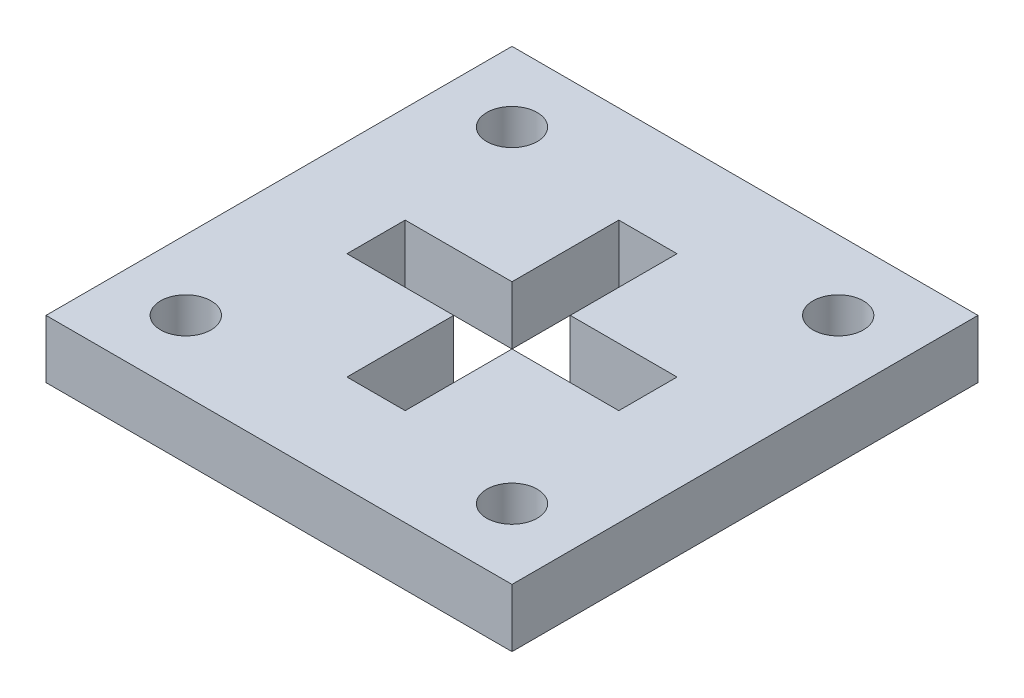
ISO-10303-21;
HEADER;
FILE_DESCRIPTION(('STEP AP214'),'2;1');
FILE_NAME('part.step','',(''),(''),'','','');
FILE_SCHEMA(('AUTOMOTIVE_DESIGN { 1 0 10303 214 1 1 1 1 }'));
ENDSEC;
DATA;
#1=APPLICATION_CONTEXT('core data for automotive mechanical design processes');
#2=APPLICATION_PROTOCOL_DEFINITION('international standard','automotive_design',2000,#1);
#3=PRODUCT_CONTEXT('',#1,'mechanical');
#4=PRODUCT('Part','Part','',(#3));
#5=PRODUCT_RELATED_PRODUCT_CATEGORY('part','',(#4));
#6=PRODUCT_DEFINITION_FORMATION('','',#4);
#7=PRODUCT_DEFINITION_CONTEXT('part definition',#1,'design');
#8=PRODUCT_DEFINITION('design','',#6,#7);
#9=PRODUCT_DEFINITION_SHAPE('','',#8);
#10=(LENGTH_UNIT() NAMED_UNIT(*) SI_UNIT(.MILLI.,.METRE.));
#11=(NAMED_UNIT(*) PLANE_ANGLE_UNIT() SI_UNIT($,.RADIAN.));
#12=(NAMED_UNIT(*) SI_UNIT($,.STERADIAN.) SOLID_ANGLE_UNIT());
#13=UNCERTAINTY_MEASURE_WITH_UNIT(LENGTH_MEASURE(1.E-05),#10,'distance_accuracy_value','');
#14=(GEOMETRIC_REPRESENTATION_CONTEXT(3) GLOBAL_UNCERTAINTY_ASSIGNED_CONTEXT((#13)) GLOBAL_UNIT_ASSIGNED_CONTEXT((#10,
#11,#12)) REPRESENTATION_CONTEXT('',''));
#15=CARTESIAN_POINT('',(0.,0.,0.));
#16=DIRECTION('',(0.,0.,1.));
#17=DIRECTION('',(1.,0.,0.));
#18=AXIS2_PLACEMENT_3D('',#15,#16,#17);
#19=CARTESIAN_POINT('',(0.,6.35,0.));
#20=DIRECTION('',(1.,0.,0.));
#21=DIRECTION('',(0.,0.,-1.));
#22=AXIS2_PLACEMENT_3D('',#19,#20,#21);
#23=PLANE('',#22);
#24=DIRECTION('',(0.,0.,1.));
#25=VECTOR('',#24,1.);
#26=CARTESIAN_POINT('',(0.,0.,0.));
#27=LINE('',#26,#25);
#28=CARTESIAN_POINT('',(0.,0.,-50.8));
#29=VERTEX_POINT('',#28);
#30=CARTESIAN_POINT('',(0.,0.,0.));
#31=VERTEX_POINT('',#30);
#32=EDGE_CURVE('E229',#29,#31,#27,.T.);
#33=ORIENTED_EDGE('',*,*,#32,.T.);
#34=DIRECTION('',(0.,-1.,0.));
#35=VECTOR('',#34,1.);
#36=CARTESIAN_POINT('',(0.,6.35,0.));
#37=LINE('',#36,#35);
#38=CARTESIAN_POINT('',(0.,6.35,0.));
#39=VERTEX_POINT('',#38);
#40=EDGE_CURVE('E11',#39,#31,#37,.T.);
#41=ORIENTED_EDGE('',*,*,#40,.F.);
#42=DIRECTION('',(0.,0.,1.));
#43=VECTOR('',#42,1.);
#44=CARTESIAN_POINT('',(0.,6.35,0.));
#45=LINE('',#44,#43);
#46=CARTESIAN_POINT('',(0.,6.35,-50.8));
#47=VERTEX_POINT('',#46);
#48=EDGE_CURVE('E249',#47,#39,#45,.T.);
#49=ORIENTED_EDGE('',*,*,#48,.F.);
#50=DIRECTION('',(0.,-1.,0.));
#51=VECTOR('',#50,1.);
#52=CARTESIAN_POINT('',(0.,6.35,-50.8));
#53=LINE('',#52,#51);
#54=EDGE_CURVE('E259',#47,#29,#53,.T.);
#55=ORIENTED_EDGE('',*,*,#54,.T.);
#56=EDGE_LOOP('',(#33,#41,#49,#55));
#57=FACE_BOUND('',#56,.T.);
#58=ADVANCED_FACE('F33',(#57),#23,.F.);
#59=CARTESIAN_POINT('',(0.,6.35,0.));
#60=DIRECTION('',(0.,0.,-1.));
#61=DIRECTION('',(-1.,0.,0.));
#62=AXIS2_PLACEMENT_3D('',#59,#60,#61);
#63=PLANE('',#62);
#64=DIRECTION('',(1.,0.,0.));
#65=VECTOR('',#64,1.);
#66=CARTESIAN_POINT('',(0.,0.,0.));
#67=LINE('',#66,#65);
#68=CARTESIAN_POINT('',(50.8,0.,0.));
#69=VERTEX_POINT('',#68);
#70=EDGE_CURVE('E262',#31,#69,#67,.T.);
#71=ORIENTED_EDGE('',*,*,#70,.T.);
#72=DIRECTION('',(0.,-1.,0.));
#73=VECTOR('',#72,1.);
#74=CARTESIAN_POINT('',(50.8,6.35,0.));
#75=LINE('',#74,#73);
#76=CARTESIAN_POINT('',(50.8,6.35,0.));
#77=VERTEX_POINT('',#76);
#78=EDGE_CURVE('E40',#77,#69,#75,.T.);
#79=ORIENTED_EDGE('',*,*,#78,.F.);
#80=DIRECTION('',(1.,0.,0.));
#81=VECTOR('',#80,1.);
#82=CARTESIAN_POINT('',(0.,6.35,0.));
#83=LINE('',#82,#81);
#84=EDGE_CURVE('E252',#39,#77,#83,.T.);
#85=ORIENTED_EDGE('',*,*,#84,.F.);
#86=ORIENTED_EDGE('',*,*,#40,.T.);
#87=EDGE_LOOP('',(#71,#79,#85,#86));
#88=FACE_BOUND('',#87,.T.);
#89=ADVANCED_FACE('F290',(#88),#63,.F.);
#90=CARTESIAN_POINT('',(50.8,6.35,0.));
#91=DIRECTION('',(-1.,0.,0.));
#92=DIRECTION('',(0.,0.,1.));
#93=AXIS2_PLACEMENT_3D('',#90,#91,#92);
#94=PLANE('',#93);
#95=DIRECTION('',(0.,0.,-1.));
#96=VECTOR('',#95,1.);
#97=CARTESIAN_POINT('',(50.8,0.,0.));
#98=LINE('',#97,#96);
#99=CARTESIAN_POINT('',(50.8,0.,-50.8));
#100=VERTEX_POINT('',#99);
#101=EDGE_CURVE('E264',#69,#100,#98,.T.);
#102=ORIENTED_EDGE('',*,*,#101,.T.);
#103=DIRECTION('',(0.,-1.,0.));
#104=VECTOR('',#103,1.);
#105=CARTESIAN_POINT('',(50.8,6.35,-50.8));
#106=LINE('',#105,#104);
#107=CARTESIAN_POINT('',(50.8,6.35,-50.8));
#108=VERTEX_POINT('',#107);
#109=EDGE_CURVE('E269',#108,#100,#106,.T.);
#110=ORIENTED_EDGE('',*,*,#109,.F.);
#111=DIRECTION('',(0.,0.,-1.));
#112=VECTOR('',#111,1.);
#113=CARTESIAN_POINT('',(50.8,6.35,0.));
#114=LINE('',#113,#112);
#115=EDGE_CURVE('E255',#77,#108,#114,.T.);
#116=ORIENTED_EDGE('',*,*,#115,.F.);
#117=ORIENTED_EDGE('',*,*,#78,.T.);
#118=EDGE_LOOP('',(#102,#110,#116,#117));
#119=FACE_BOUND('',#118,.T.);
#120=ADVANCED_FACE('F276',(#119),#94,.F.);
#121=CARTESIAN_POINT('',(0.,6.35,-50.8));
#122=DIRECTION('',(0.,0.,1.));
#123=DIRECTION('',(1.,0.,0.));
#124=AXIS2_PLACEMENT_3D('',#121,#122,#123);
#125=PLANE('',#124);
#126=DIRECTION('',(-1.,0.,0.));
#127=VECTOR('',#126,1.);
#128=CARTESIAN_POINT('',(0.,0.,-50.8));
#129=LINE('',#128,#127);
#130=EDGE_CURVE('E253',#100,#29,#129,.T.);
#131=ORIENTED_EDGE('',*,*,#130,.T.);
#132=ORIENTED_EDGE('',*,*,#54,.F.);
#133=DIRECTION('',(-1.,0.,0.));
#134=VECTOR('',#133,1.);
#135=CARTESIAN_POINT('',(0.,6.35,-50.8));
#136=LINE('',#135,#134);
#137=EDGE_CURVE('E257',#108,#47,#136,.T.);
#138=ORIENTED_EDGE('',*,*,#137,.F.);
#139=ORIENTED_EDGE('',*,*,#109,.T.);
#140=EDGE_LOOP('',(#131,#132,#138,#139));
#141=FACE_BOUND('',#140,.T.);
#142=ADVANCED_FACE('F283',(#141),#125,.F.);
#143=CARTESIAN_POINT('',(0.,6.35,0.));
#144=DIRECTION('',(0.,-1.,0.));
#145=DIRECTION('',(0.,0.,-1.));
#146=AXIS2_PLACEMENT_3D('',#143,#144,#145);
#147=PLANE('',#146);
#148=CARTESIAN_POINT('',(7.61999999999999,6.35,-43.18));
#149=DIRECTION('',(0.,1.,0.));
#150=DIRECTION('',(0.,0.,1.));
#151=AXIS2_PLACEMENT_3D('',#148,#149,#150);
#152=CIRCLE('',#151,2.75);
#153=CARTESIAN_POINT('',(7.61999999999999,6.35,-40.43));
#154=VERTEX_POINT('',#153);
#155=EDGE_CURVE('E372',#154,#154,#152,.T.);
#156=ORIENTED_EDGE('',*,*,#155,.F.);
#157=EDGE_LOOP('',(#156));
#158=FACE_BOUND('',#157,.T.);
#159=CARTESIAN_POINT('',(43.18,6.35,-43.18));
#160=DIRECTION('',(0.,1.,0.));
#161=DIRECTION('',(0.,0.,1.));
#162=AXIS2_PLACEMENT_3D('',#159,#160,#161);
#163=CIRCLE('',#162,2.75);
#164=CARTESIAN_POINT('',(43.18,6.35,-40.43));
#165=VERTEX_POINT('',#164);
#166=EDGE_CURVE('E374',#165,#165,#163,.T.);
#167=ORIENTED_EDGE('',*,*,#166,.F.);
#168=EDGE_LOOP('',(#167));
#169=FACE_BOUND('',#168,.T.);
#170=CARTESIAN_POINT('',(43.18,6.35,-7.62));
#171=DIRECTION('',(0.,1.,0.));
#172=DIRECTION('',(0.,0.,1.));
#173=AXIS2_PLACEMENT_3D('',#170,#171,#172);
#174=CIRCLE('',#173,2.75);
#175=CARTESIAN_POINT('',(43.18,6.35,-4.87));
#176=VERTEX_POINT('',#175);
#177=EDGE_CURVE('E382',#176,#176,#174,.T.);
#178=ORIENTED_EDGE('',*,*,#177,.F.);
#179=EDGE_LOOP('',(#178));
#180=FACE_BOUND('',#179,.T.);
#181=CARTESIAN_POINT('',(7.61999999999999,6.35,-7.62));
#182=DIRECTION('',(0.,1.,0.));
#183=DIRECTION('',(0.,0.,1.));
#184=AXIS2_PLACEMENT_3D('',#181,#182,#183);
#185=CIRCLE('',#184,2.75);
#186=CARTESIAN_POINT('',(7.61999999999999,6.35,-4.87));
#187=VERTEX_POINT('',#186);
#188=EDGE_CURVE('E387',#187,#187,#185,.T.);
#189=ORIENTED_EDGE('',*,*,#188,.F.);
#190=EDGE_LOOP('',(#189));
#191=FACE_BOUND('',#190,.T.);
#192=DIRECTION('',(-1.,0.,0.));
#193=VECTOR('',#192,1.);
#194=CARTESIAN_POINT('',(10.5833333333333,6.35,-28.575));
#195=LINE('',#194,#193);
#196=CARTESIAN_POINT('',(22.225,6.35,-28.575));
#197=VERTEX_POINT('',#196);
#198=CARTESIAN_POINT('',(10.5833333333333,6.35,-28.575));
#199=VERTEX_POINT('',#198);
#200=EDGE_CURVE('E199',#197,#199,#195,.T.);
#201=ORIENTED_EDGE('',*,*,#200,.F.);
#202=DIRECTION('',(0.,0.,1.));
#203=VECTOR('',#202,1.);
#204=CARTESIAN_POINT('',(22.225,6.35,-40.2166666666666));
#205=LINE('',#204,#203);
#206=CARTESIAN_POINT('',(22.225,6.35,-40.2166666666666));
#207=VERTEX_POINT('',#206);
#208=EDGE_CURVE('E47',#207,#197,#205,.T.);
#209=ORIENTED_EDGE('',*,*,#208,.F.);
#210=DIRECTION('',(-1.,0.,0.));
#211=VECTOR('',#210,1.);
#212=CARTESIAN_POINT('',(22.225,6.35,-40.2166666666666));
#213=LINE('',#212,#211);
#214=CARTESIAN_POINT('',(28.575,6.35,-40.2166666666666));
#215=VERTEX_POINT('',#214);
#216=EDGE_CURVE('E164',#215,#207,#213,.T.);
#217=ORIENTED_EDGE('',*,*,#216,.F.);
#218=DIRECTION('',(0.,0.,-1.));
#219=VECTOR('',#218,1.);
#220=CARTESIAN_POINT('',(28.575,6.35,-40.2166666666666));
#221=LINE('',#220,#219);
#222=CARTESIAN_POINT('',(28.575,6.35,-28.575));
#223=VERTEX_POINT('',#222);
#224=EDGE_CURVE('E167',#223,#215,#221,.T.);
#225=ORIENTED_EDGE('',*,*,#224,.F.);
#226=DIRECTION('',(-1.,0.,0.));
#227=VECTOR('',#226,1.);
#228=CARTESIAN_POINT('',(28.575,6.35,-28.575));
#229=LINE('',#228,#227);
#230=CARTESIAN_POINT('',(40.2166666666667,6.35,-28.575));
#231=VERTEX_POINT('',#230);
#232=EDGE_CURVE('E222',#231,#223,#229,.T.);
#233=ORIENTED_EDGE('',*,*,#232,.F.);
#234=DIRECTION('',(0.,0.,-1.));
#235=VECTOR('',#234,1.);
#236=CARTESIAN_POINT('',(40.2166666666667,6.35,-28.575));
#237=LINE('',#236,#235);
#238=CARTESIAN_POINT('',(40.2166666666667,6.35,-22.225));
#239=VERTEX_POINT('',#238);
#240=EDGE_CURVE('E219',#239,#231,#237,.T.);
#241=ORIENTED_EDGE('',*,*,#240,.F.);
#242=DIRECTION('',(1.,0.,0.));
#243=VECTOR('',#242,1.);
#244=CARTESIAN_POINT('',(28.575,6.35,-22.225));
#245=LINE('',#244,#243);
#246=CARTESIAN_POINT('',(28.575,6.35,-22.225));
#247=VERTEX_POINT('',#246);
#248=EDGE_CURVE('E216',#247,#239,#245,.T.);
#249=ORIENTED_EDGE('',*,*,#248,.F.);
#250=DIRECTION('',(0.,0.,-1.));
#251=VECTOR('',#250,1.);
#252=CARTESIAN_POINT('',(28.575,6.35,-22.225));
#253=LINE('',#252,#251);
#254=CARTESIAN_POINT('',(28.575,6.35,-10.5833333333333));
#255=VERTEX_POINT('',#254);
#256=EDGE_CURVE('E213',#255,#247,#253,.T.);
#257=ORIENTED_EDGE('',*,*,#256,.F.);
#258=DIRECTION('',(1.,0.,0.));
#259=VECTOR('',#258,1.);
#260=CARTESIAN_POINT('',(22.225,6.35,-10.5833333333333));
#261=LINE('',#260,#259);
#262=CARTESIAN_POINT('',(22.225,6.35,-10.5833333333333));
#263=VERTEX_POINT('',#262);
#264=EDGE_CURVE('E210',#263,#255,#261,.T.);
#265=ORIENTED_EDGE('',*,*,#264,.F.);
#266=DIRECTION('',(0.,0.,1.));
#267=VECTOR('',#266,1.);
#268=CARTESIAN_POINT('',(22.225,6.35,-22.225));
#269=LINE('',#268,#267);
#270=CARTESIAN_POINT('',(22.225,6.35,-22.225));
#271=VERTEX_POINT('',#270);
#272=EDGE_CURVE('E207',#271,#263,#269,.T.);
#273=ORIENTED_EDGE('',*,*,#272,.F.);
#274=DIRECTION('',(1.,0.,0.));
#275=VECTOR('',#274,1.);
#276=CARTESIAN_POINT('',(10.5833333333333,6.35,-22.225));
#277=LINE('',#276,#275);
#278=CARTESIAN_POINT('',(10.5833333333333,6.35,-22.225));
#279=VERTEX_POINT('',#278);
#280=EDGE_CURVE('E204',#279,#271,#277,.T.);
#281=ORIENTED_EDGE('',*,*,#280,.F.);
#282=DIRECTION('',(0.,0.,1.));
#283=VECTOR('',#282,1.);
#284=CARTESIAN_POINT('',(10.5833333333333,6.35,-28.575));
#285=LINE('',#284,#283);
#286=EDGE_CURVE('E201',#199,#279,#285,.T.);
#287=ORIENTED_EDGE('',*,*,#286,.F.);
#288=EDGE_LOOP('',(#201,#209,#217,#225,#233,#241,#249,#257,#265,#273,#281,#287));
#289=FACE_BOUND('',#288,.T.);
#290=ORIENTED_EDGE('',*,*,#48,.T.);
#291=ORIENTED_EDGE('',*,*,#84,.T.);
#292=ORIENTED_EDGE('',*,*,#115,.T.);
#293=ORIENTED_EDGE('',*,*,#137,.T.);
#294=EDGE_LOOP('',(#290,#291,#292,#293));
#295=FACE_BOUND('',#294,.T.);
#296=ADVANCED_FACE('F289',(#158,#169,#180,#191,#289,#295),#147,.F.);
#297=CARTESIAN_POINT('',(0.,0.,0.));
#298=DIRECTION('',(0.,-1.,0.));
#299=DIRECTION('',(0.,0.,-1.));
#300=AXIS2_PLACEMENT_3D('',#297,#298,#299);
#301=PLANE('',#300);
#302=CARTESIAN_POINT('',(7.61999999999999,0.,-43.18));
#303=DIRECTION('',(0.,1.,0.));
#304=DIRECTION('',(0.,0.,1.));
#305=AXIS2_PLACEMENT_3D('',#302,#303,#304);
#306=CIRCLE('',#305,2.75);
#307=CARTESIAN_POINT('',(7.61999999999999,0.,-40.43));
#308=VERTEX_POINT('',#307);
#309=EDGE_CURVE('E369',#308,#308,#306,.T.);
#310=ORIENTED_EDGE('',*,*,#309,.T.);
#311=EDGE_LOOP('',(#310));
#312=FACE_BOUND('',#311,.T.);
#313=CARTESIAN_POINT('',(43.18,0.,-43.18));
#314=DIRECTION('',(0.,1.,0.));
#315=DIRECTION('',(0.,0.,1.));
#316=AXIS2_PLACEMENT_3D('',#313,#314,#315);
#317=CIRCLE('',#316,2.75);
#318=CARTESIAN_POINT('',(43.18,0.,-40.43));
#319=VERTEX_POINT('',#318);
#320=EDGE_CURVE('E379',#319,#319,#317,.T.);
#321=ORIENTED_EDGE('',*,*,#320,.T.);
#322=EDGE_LOOP('',(#321));
#323=FACE_BOUND('',#322,.T.);
#324=CARTESIAN_POINT('',(43.18,0.,-7.62));
#325=DIRECTION('',(0.,1.,0.));
#326=DIRECTION('',(0.,0.,1.));
#327=AXIS2_PLACEMENT_3D('',#324,#325,#326);
#328=CIRCLE('',#327,2.75);
#329=CARTESIAN_POINT('',(43.18,0.,-4.87000000000001));
#330=VERTEX_POINT('',#329);
#331=EDGE_CURVE('E385',#330,#330,#328,.T.);
#332=ORIENTED_EDGE('',*,*,#331,.T.);
#333=EDGE_LOOP('',(#332));
#334=FACE_BOUND('',#333,.T.);
#335=CARTESIAN_POINT('',(7.61999999999999,0.,-7.62));
#336=DIRECTION('',(0.,1.,0.));
#337=DIRECTION('',(0.,0.,1.));
#338=AXIS2_PLACEMENT_3D('',#335,#336,#337);
#339=CIRCLE('',#338,2.75);
#340=CARTESIAN_POINT('',(7.61999999999999,0.,-4.87));
#341=VERTEX_POINT('',#340);
#342=EDGE_CURVE('E170',#341,#341,#339,.T.);
#343=ORIENTED_EDGE('',*,*,#342,.T.);
#344=EDGE_LOOP('',(#343));
#345=FACE_BOUND('',#344,.T.);
#346=DIRECTION('',(0.,0.,1.));
#347=VECTOR('',#346,1.);
#348=CARTESIAN_POINT('',(22.225,0.,-40.2166666666666));
#349=LINE('',#348,#347);
#350=CARTESIAN_POINT('',(22.225,0.,-40.2166666666666));
#351=VERTEX_POINT('',#350);
#352=CARTESIAN_POINT('',(22.225,0.,-28.575));
#353=VERTEX_POINT('',#352);
#354=EDGE_CURVE('E147',#351,#353,#349,.T.);
#355=ORIENTED_EDGE('',*,*,#354,.T.);
#356=DIRECTION('',(-1.,0.,0.));
#357=VECTOR('',#356,1.);
#358=CARTESIAN_POINT('',(10.5833333333333,0.,-28.575));
#359=LINE('',#358,#357);
#360=CARTESIAN_POINT('',(10.5833333333333,0.,-28.575));
#361=VERTEX_POINT('',#360);
#362=EDGE_CURVE('E156',#353,#361,#359,.T.);
#363=ORIENTED_EDGE('',*,*,#362,.T.);
#364=DIRECTION('',(0.,0.,1.));
#365=VECTOR('',#364,1.);
#366=CARTESIAN_POINT('',(10.5833333333333,0.,-28.575));
#367=LINE('',#366,#365);
#368=CARTESIAN_POINT('',(10.5833333333333,0.,-22.225));
#369=VERTEX_POINT('',#368);
#370=EDGE_CURVE('E55',#361,#369,#367,.T.);
#371=ORIENTED_EDGE('',*,*,#370,.T.);
#372=DIRECTION('',(1.,0.,0.));
#373=VECTOR('',#372,1.);
#374=CARTESIAN_POINT('',(10.5833333333333,0.,-22.225));
#375=LINE('',#374,#373);
#376=CARTESIAN_POINT('',(22.225,0.,-22.225));
#377=VERTEX_POINT('',#376);
#378=EDGE_CURVE('E174',#369,#377,#375,.T.);
#379=ORIENTED_EDGE('',*,*,#378,.T.);
#380=DIRECTION('',(0.,0.,1.));
#381=VECTOR('',#380,1.);
#382=CARTESIAN_POINT('',(22.225,0.,-22.225));
#383=LINE('',#382,#381);
#384=CARTESIAN_POINT('',(22.225,0.,-10.5833333333333));
#385=VERTEX_POINT('',#384);
#386=EDGE_CURVE('E177',#377,#385,#383,.T.);
#387=ORIENTED_EDGE('',*,*,#386,.T.);
#388=DIRECTION('',(1.,0.,0.));
#389=VECTOR('',#388,1.);
#390=CARTESIAN_POINT('',(22.225,0.,-10.5833333333333));
#391=LINE('',#390,#389);
#392=CARTESIAN_POINT('',(28.575,0.,-10.5833333333333));
#393=VERTEX_POINT('',#392);
#394=EDGE_CURVE('E180',#385,#393,#391,.T.);
#395=ORIENTED_EDGE('',*,*,#394,.T.);
#396=DIRECTION('',(0.,0.,-1.));
#397=VECTOR('',#396,1.);
#398=CARTESIAN_POINT('',(28.575,0.,-22.225));
#399=LINE('',#398,#397);
#400=CARTESIAN_POINT('',(28.575,0.,-22.225));
#401=VERTEX_POINT('',#400);
#402=EDGE_CURVE('E183',#393,#401,#399,.T.);
#403=ORIENTED_EDGE('',*,*,#402,.T.);
#404=DIRECTION('',(1.,0.,0.));
#405=VECTOR('',#404,1.);
#406=CARTESIAN_POINT('',(28.575,0.,-22.225));
#407=LINE('',#406,#405);
#408=CARTESIAN_POINT('',(40.2166666666667,0.,-22.225));
#409=VERTEX_POINT('',#408);
#410=EDGE_CURVE('E186',#401,#409,#407,.T.);
#411=ORIENTED_EDGE('',*,*,#410,.T.);
#412=DIRECTION('',(0.,0.,-1.));
#413=VECTOR('',#412,1.);
#414=CARTESIAN_POINT('',(40.2166666666667,0.,-28.575));
#415=LINE('',#414,#413);
#416=CARTESIAN_POINT('',(40.2166666666667,0.,-28.575));
#417=VERTEX_POINT('',#416);
#418=EDGE_CURVE('E189',#409,#417,#415,.T.);
#419=ORIENTED_EDGE('',*,*,#418,.T.);
#420=DIRECTION('',(-1.,0.,0.));
#421=VECTOR('',#420,1.);
#422=CARTESIAN_POINT('',(28.575,0.,-28.575));
#423=LINE('',#422,#421);
#424=CARTESIAN_POINT('',(28.575,0.,-28.575));
#425=VERTEX_POINT('',#424);
#426=EDGE_CURVE('E192',#417,#425,#423,.T.);
#427=ORIENTED_EDGE('',*,*,#426,.T.);
#428=DIRECTION('',(0.,0.,-1.));
#429=VECTOR('',#428,1.);
#430=CARTESIAN_POINT('',(28.575,0.,-40.2166666666666));
#431=LINE('',#430,#429);
#432=CARTESIAN_POINT('',(28.575,0.,-40.2166666666666));
#433=VERTEX_POINT('',#432);
#434=EDGE_CURVE('E195',#425,#433,#431,.T.);
#435=ORIENTED_EDGE('',*,*,#434,.T.);
#436=DIRECTION('',(-1.,0.,0.));
#437=VECTOR('',#436,1.);
#438=CARTESIAN_POINT('',(22.225,0.,-40.2166666666666));
#439=LINE('',#438,#437);
#440=EDGE_CURVE('E153',#433,#351,#439,.T.);
#441=ORIENTED_EDGE('',*,*,#440,.T.);
#442=EDGE_LOOP('',(#355,#363,#371,#379,#387,#395,#403,#411,#419,#427,#435,#441));
#443=FACE_BOUND('',#442,.T.);
#444=ORIENTED_EDGE('',*,*,#32,.F.);
#445=ORIENTED_EDGE('',*,*,#130,.F.);
#446=ORIENTED_EDGE('',*,*,#101,.F.);
#447=ORIENTED_EDGE('',*,*,#70,.F.);
#448=EDGE_LOOP('',(#444,#445,#446,#447));
#449=FACE_BOUND('',#448,.T.);
#450=ADVANCED_FACE('F160',(#312,#323,#334,#345,#443,#449),#301,.T.);
#451=CARTESIAN_POINT('',(22.225,0.,-40.2166666666666));
#452=DIRECTION('',(-1.,0.,0.));
#453=DIRECTION('',(0.,0.,1.));
#454=AXIS2_PLACEMENT_3D('',#451,#452,#453);
#455=PLANE('',#454);
#456=ORIENTED_EDGE('',*,*,#208,.T.);
#457=DIRECTION('',(0.,1.,0.));
#458=VECTOR('',#457,1.);
#459=CARTESIAN_POINT('',(22.225,0.,-28.575));
#460=LINE('',#459,#458);
#461=EDGE_CURVE('E143',#353,#197,#460,.T.);
#462=ORIENTED_EDGE('',*,*,#461,.F.);
#463=ORIENTED_EDGE('',*,*,#354,.F.);
#464=DIRECTION('',(0.,1.,0.));
#465=VECTOR('',#464,1.);
#466=CARTESIAN_POINT('',(22.225,0.,-40.2166666666666));
#467=LINE('',#466,#465);
#468=EDGE_CURVE('E227',#351,#207,#467,.T.);
#469=ORIENTED_EDGE('',*,*,#468,.T.);
#470=EDGE_LOOP('',(#456,#462,#463,#469));
#471=FACE_BOUND('',#470,.T.);
#472=ADVANCED_FACE('F145',(#471),#455,.F.);
#473=CARTESIAN_POINT('',(22.225,0.,-40.2166666666666));
#474=DIRECTION('',(0.,0.,-1.));
#475=DIRECTION('',(-1.,0.,0.));
#476=AXIS2_PLACEMENT_3D('',#473,#474,#475);
#477=PLANE('',#476);
#478=ORIENTED_EDGE('',*,*,#216,.T.);
#479=ORIENTED_EDGE('',*,*,#468,.F.);
#480=ORIENTED_EDGE('',*,*,#440,.F.);
#481=DIRECTION('',(0.,1.,0.));
#482=VECTOR('',#481,1.);
#483=CARTESIAN_POINT('',(28.575,0.,-40.2166666666666));
#484=LINE('',#483,#482);
#485=EDGE_CURVE('E230',#433,#215,#484,.T.);
#486=ORIENTED_EDGE('',*,*,#485,.T.);
#487=EDGE_LOOP('',(#478,#479,#480,#486));
#488=FACE_BOUND('',#487,.T.);
#489=ADVANCED_FACE('F308',(#488),#477,.F.);
#490=CARTESIAN_POINT('',(28.575,0.,-40.2166666666666));
#491=DIRECTION('',(1.,0.,0.));
#492=DIRECTION('',(0.,0.,-1.));
#493=AXIS2_PLACEMENT_3D('',#490,#491,#492);
#494=PLANE('',#493);
#495=ORIENTED_EDGE('',*,*,#224,.T.);
#496=ORIENTED_EDGE('',*,*,#485,.F.);
#497=ORIENTED_EDGE('',*,*,#434,.F.);
#498=DIRECTION('',(0.,1.,0.));
#499=VECTOR('',#498,1.);
#500=CARTESIAN_POINT('',(28.575,0.,-28.575));
#501=LINE('',#500,#499);
#502=EDGE_CURVE('E232',#425,#223,#501,.T.);
#503=ORIENTED_EDGE('',*,*,#502,.T.);
#504=EDGE_LOOP('',(#495,#496,#497,#503));
#505=FACE_BOUND('',#504,.T.);
#506=ADVANCED_FACE('F342',(#505),#494,.F.);
#507=CARTESIAN_POINT('',(28.575,0.,-28.575));
#508=DIRECTION('',(0.,0.,-1.));
#509=DIRECTION('',(-1.,0.,0.));
#510=AXIS2_PLACEMENT_3D('',#507,#508,#509);
#511=PLANE('',#510);
#512=ORIENTED_EDGE('',*,*,#232,.T.);
#513=ORIENTED_EDGE('',*,*,#502,.F.);
#514=ORIENTED_EDGE('',*,*,#426,.F.);
#515=DIRECTION('',(0.,1.,0.));
#516=VECTOR('',#515,1.);
#517=CARTESIAN_POINT('',(40.2166666666667,0.,-28.575));
#518=LINE('',#517,#516);
#519=EDGE_CURVE('E234',#417,#231,#518,.T.);
#520=ORIENTED_EDGE('',*,*,#519,.T.);
#521=EDGE_LOOP('',(#512,#513,#514,#520));
#522=FACE_BOUND('',#521,.T.);
#523=ADVANCED_FACE('F338',(#522),#511,.F.);
#524=CARTESIAN_POINT('',(40.2166666666667,0.,-28.575));
#525=DIRECTION('',(1.,0.,0.));
#526=DIRECTION('',(0.,0.,-1.));
#527=AXIS2_PLACEMENT_3D('',#524,#525,#526);
#528=PLANE('',#527);
#529=ORIENTED_EDGE('',*,*,#240,.T.);
#530=ORIENTED_EDGE('',*,*,#519,.F.);
#531=ORIENTED_EDGE('',*,*,#418,.F.);
#532=DIRECTION('',(0.,1.,0.));
#533=VECTOR('',#532,1.);
#534=CARTESIAN_POINT('',(40.2166666666667,0.,-22.225));
#535=LINE('',#534,#533);
#536=EDGE_CURVE('E236',#409,#239,#535,.T.);
#537=ORIENTED_EDGE('',*,*,#536,.T.);
#538=EDGE_LOOP('',(#529,#530,#531,#537));
#539=FACE_BOUND('',#538,.T.);
#540=ADVANCED_FACE('F334',(#539),#528,.F.);
#541=CARTESIAN_POINT('',(28.575,0.,-22.225));
#542=DIRECTION('',(0.,0.,1.));
#543=DIRECTION('',(1.,0.,0.));
#544=AXIS2_PLACEMENT_3D('',#541,#542,#543);
#545=PLANE('',#544);
#546=ORIENTED_EDGE('',*,*,#248,.T.);
#547=ORIENTED_EDGE('',*,*,#536,.F.);
#548=ORIENTED_EDGE('',*,*,#410,.F.);
#549=DIRECTION('',(0.,1.,0.));
#550=VECTOR('',#549,1.);
#551=CARTESIAN_POINT('',(28.575,0.,-22.225));
#552=LINE('',#551,#550);
#553=EDGE_CURVE('E238',#401,#247,#552,.T.);
#554=ORIENTED_EDGE('',*,*,#553,.T.);
#555=EDGE_LOOP('',(#546,#547,#548,#554));
#556=FACE_BOUND('',#555,.T.);
#557=ADVANCED_FACE('F330',(#556),#545,.F.);
#558=CARTESIAN_POINT('',(28.575,0.,-22.225));
#559=DIRECTION('',(1.,0.,0.));
#560=DIRECTION('',(0.,0.,-1.));
#561=AXIS2_PLACEMENT_3D('',#558,#559,#560);
#562=PLANE('',#561);
#563=ORIENTED_EDGE('',*,*,#256,.T.);
#564=ORIENTED_EDGE('',*,*,#553,.F.);
#565=ORIENTED_EDGE('',*,*,#402,.F.);
#566=DIRECTION('',(0.,1.,0.));
#567=VECTOR('',#566,1.);
#568=CARTESIAN_POINT('',(28.575,0.,-10.5833333333333));
#569=LINE('',#568,#567);
#570=EDGE_CURVE('E240',#393,#255,#569,.T.);
#571=ORIENTED_EDGE('',*,*,#570,.T.);
#572=EDGE_LOOP('',(#563,#564,#565,#571));
#573=FACE_BOUND('',#572,.T.);
#574=ADVANCED_FACE('F326',(#573),#562,.F.);
#575=CARTESIAN_POINT('',(22.225,0.,-10.5833333333333));
#576=DIRECTION('',(0.,0.,1.));
#577=DIRECTION('',(1.,0.,0.));
#578=AXIS2_PLACEMENT_3D('',#575,#576,#577);
#579=PLANE('',#578);
#580=ORIENTED_EDGE('',*,*,#264,.T.);
#581=ORIENTED_EDGE('',*,*,#570,.F.);
#582=ORIENTED_EDGE('',*,*,#394,.F.);
#583=DIRECTION('',(0.,1.,0.));
#584=VECTOR('',#583,1.);
#585=CARTESIAN_POINT('',(22.225,0.,-10.5833333333333));
#586=LINE('',#585,#584);
#587=EDGE_CURVE('E242',#385,#263,#586,.T.);
#588=ORIENTED_EDGE('',*,*,#587,.T.);
#589=EDGE_LOOP('',(#580,#581,#582,#588));
#590=FACE_BOUND('',#589,.T.);
#591=ADVANCED_FACE('F322',(#590),#579,.F.);
#592=CARTESIAN_POINT('',(22.225,0.,-22.225));
#593=DIRECTION('',(-1.,0.,0.));
#594=DIRECTION('',(0.,0.,1.));
#595=AXIS2_PLACEMENT_3D('',#592,#593,#594);
#596=PLANE('',#595);
#597=ORIENTED_EDGE('',*,*,#272,.T.);
#598=ORIENTED_EDGE('',*,*,#587,.F.);
#599=ORIENTED_EDGE('',*,*,#386,.F.);
#600=DIRECTION('',(0.,1.,0.));
#601=VECTOR('',#600,1.);
#602=CARTESIAN_POINT('',(22.225,0.,-22.225));
#603=LINE('',#602,#601);
#604=EDGE_CURVE('E244',#377,#271,#603,.T.);
#605=ORIENTED_EDGE('',*,*,#604,.T.);
#606=EDGE_LOOP('',(#597,#598,#599,#605));
#607=FACE_BOUND('',#606,.T.);
#608=ADVANCED_FACE('F318',(#607),#596,.F.);
#609=CARTESIAN_POINT('',(10.5833333333333,0.,-22.225));
#610=DIRECTION('',(0.,0.,1.));
#611=DIRECTION('',(1.,0.,0.));
#612=AXIS2_PLACEMENT_3D('',#609,#610,#611);
#613=PLANE('',#612);
#614=ORIENTED_EDGE('',*,*,#280,.T.);
#615=ORIENTED_EDGE('',*,*,#604,.F.);
#616=ORIENTED_EDGE('',*,*,#378,.F.);
#617=DIRECTION('',(0.,1.,0.));
#618=VECTOR('',#617,1.);
#619=CARTESIAN_POINT('',(10.5833333333333,0.,-22.225));
#620=LINE('',#619,#618);
#621=EDGE_CURVE('E246',#369,#279,#620,.T.);
#622=ORIENTED_EDGE('',*,*,#621,.T.);
#623=EDGE_LOOP('',(#614,#615,#616,#622));
#624=FACE_BOUND('',#623,.T.);
#625=ADVANCED_FACE('F315',(#624),#613,.F.);
#626=CARTESIAN_POINT('',(10.5833333333333,0.,-28.575));
#627=DIRECTION('',(-1.,0.,0.));
#628=DIRECTION('',(0.,0.,1.));
#629=AXIS2_PLACEMENT_3D('',#626,#627,#628);
#630=PLANE('',#629);
#631=ORIENTED_EDGE('',*,*,#286,.T.);
#632=ORIENTED_EDGE('',*,*,#621,.F.);
#633=ORIENTED_EDGE('',*,*,#370,.F.);
#634=DIRECTION('',(0.,1.,0.));
#635=VECTOR('',#634,1.);
#636=CARTESIAN_POINT('',(10.5833333333333,0.,-28.575));
#637=LINE('',#636,#635);
#638=EDGE_CURVE('E152',#361,#199,#637,.T.);
#639=ORIENTED_EDGE('',*,*,#638,.T.);
#640=EDGE_LOOP('',(#631,#632,#633,#639));
#641=FACE_BOUND('',#640,.T.);
#642=ADVANCED_FACE('F312',(#641),#630,.F.);
#643=CARTESIAN_POINT('',(10.5833333333333,0.,-28.575));
#644=DIRECTION('',(0.,0.,-1.));
#645=DIRECTION('',(-1.,0.,0.));
#646=AXIS2_PLACEMENT_3D('',#643,#644,#645);
#647=PLANE('',#646);
#648=ORIENTED_EDGE('',*,*,#200,.T.);
#649=ORIENTED_EDGE('',*,*,#638,.F.);
#650=ORIENTED_EDGE('',*,*,#362,.F.);
#651=ORIENTED_EDGE('',*,*,#461,.T.);
#652=EDGE_LOOP('',(#648,#649,#650,#651));
#653=FACE_BOUND('',#652,.T.);
#654=ADVANCED_FACE('F157',(#653),#647,.F.);
#655=CARTESIAN_POINT('',(7.61999999999999,6.35,-7.62));
#656=DIRECTION('',(0.,1.,0.));
#657=DIRECTION('',(0.,0.,1.));
#658=AXIS2_PLACEMENT_3D('',#655,#656,#657);
#659=CYLINDRICAL_SURFACE('',#658,2.75);
#660=ORIENTED_EDGE('',*,*,#342,.F.);
#661=EDGE_LOOP('',(#660));
#662=FACE_BOUND('',#661,.T.);
#663=ORIENTED_EDGE('',*,*,#188,.T.);
#664=EDGE_LOOP('',(#663));
#665=FACE_BOUND('',#664,.T.);
#666=ADVANCED_FACE('F311',(#662,#665),#659,.F.);
#667=CARTESIAN_POINT('',(43.18,6.35,-7.62));
#668=DIRECTION('',(0.,1.,0.));
#669=DIRECTION('',(0.,0.,1.));
#670=AXIS2_PLACEMENT_3D('',#667,#668,#669);
#671=CYLINDRICAL_SURFACE('',#670,2.75);
#672=ORIENTED_EDGE('',*,*,#331,.F.);
#673=EDGE_LOOP('',(#672));
#674=FACE_BOUND('',#673,.T.);
#675=ORIENTED_EDGE('',*,*,#177,.T.);
#676=EDGE_LOOP('',(#675));
#677=FACE_BOUND('',#676,.T.);
#678=ADVANCED_FACE('F352',(#674,#677),#671,.F.);
#679=CARTESIAN_POINT('',(43.18,6.35,-43.18));
#680=DIRECTION('',(0.,1.,0.));
#681=DIRECTION('',(0.,0.,1.));
#682=AXIS2_PLACEMENT_3D('',#679,#680,#681);
#683=CYLINDRICAL_SURFACE('',#682,2.75);
#684=ORIENTED_EDGE('',*,*,#320,.F.);
#685=EDGE_LOOP('',(#684));
#686=FACE_BOUND('',#685,.T.);
#687=ORIENTED_EDGE('',*,*,#166,.T.);
#688=EDGE_LOOP('',(#687));
#689=FACE_BOUND('',#688,.T.);
#690=ADVANCED_FACE('F356',(#686,#689),#683,.F.);
#691=CARTESIAN_POINT('',(7.61999999999999,6.35,-43.18));
#692=DIRECTION('',(0.,1.,0.));
#693=DIRECTION('',(0.,0.,1.));
#694=AXIS2_PLACEMENT_3D('',#691,#692,#693);
#695=CYLINDRICAL_SURFACE('',#694,2.75);
#696=ORIENTED_EDGE('',*,*,#309,.F.);
#697=EDGE_LOOP('',(#696));
#698=FACE_BOUND('',#697,.T.);
#699=ORIENTED_EDGE('',*,*,#155,.T.);
#700=EDGE_LOOP('',(#699));
#701=FACE_BOUND('',#700,.T.);
#702=ADVANCED_FACE('F360',(#698,#701),#695,.F.);
#703=CLOSED_SHELL('',(#58,#89,#120,#142,#296,#450,#472,#489,#506,#523,#540,#557,#574,#591,#608,
#625,#642,#654,#666,#678,#690,#702));
#704=MANIFOLD_SOLID_BREP('B2',#703);
#705=ADVANCED_BREP_SHAPE_REPRESENTATION('',(#18,#704),#14);
#706=SHAPE_DEFINITION_REPRESENTATION(#9,#705);
ENDSEC;
END-ISO-10303-21;
